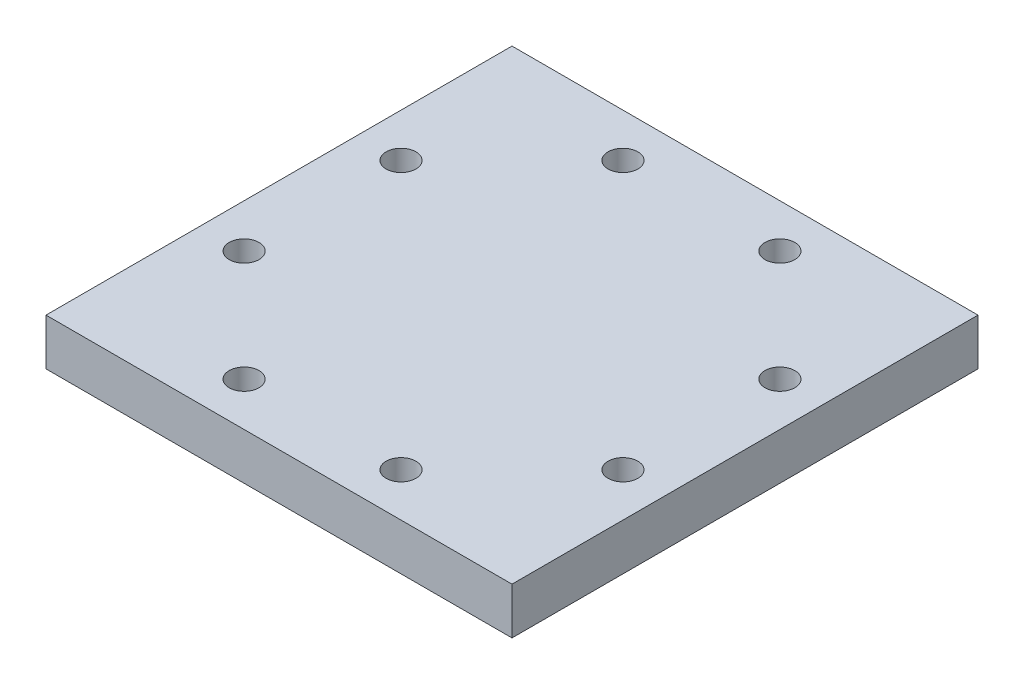
ISO-10303-21;
HEADER;
FILE_DESCRIPTION(('STEP AP214'),'2;1');
FILE_NAME('part.step','',(''),(''),'','','');
FILE_SCHEMA(('AUTOMOTIVE_DESIGN { 1 0 10303 214 1 1 1 1 }'));
ENDSEC;
DATA;
#1=APPLICATION_CONTEXT('core data for automotive mechanical design processes');
#2=APPLICATION_PROTOCOL_DEFINITION('international standard','automotive_design',2000,#1);
#3=PRODUCT_CONTEXT('',#1,'mechanical');
#4=PRODUCT('Part','Part','',(#3));
#5=PRODUCT_RELATED_PRODUCT_CATEGORY('part','',(#4));
#6=PRODUCT_DEFINITION_FORMATION('','',#4);
#7=PRODUCT_DEFINITION_CONTEXT('part definition',#1,'design');
#8=PRODUCT_DEFINITION('design','',#6,#7);
#9=PRODUCT_DEFINITION_SHAPE('','',#8);
#10=(LENGTH_UNIT() NAMED_UNIT(*) SI_UNIT(.MILLI.,.METRE.));
#11=(NAMED_UNIT(*) PLANE_ANGLE_UNIT() SI_UNIT($,.RADIAN.));
#12=(NAMED_UNIT(*) SI_UNIT($,.STERADIAN.) SOLID_ANGLE_UNIT());
#13=UNCERTAINTY_MEASURE_WITH_UNIT(LENGTH_MEASURE(1.E-05),#10,'distance_accuracy_value','');
#14=(GEOMETRIC_REPRESENTATION_CONTEXT(3) GLOBAL_UNCERTAINTY_ASSIGNED_CONTEXT((#13)) GLOBAL_UNIT_ASSIGNED_CONTEXT((#10,
#11,#12)) REPRESENTATION_CONTEXT('',''));
#15=CARTESIAN_POINT('',(0.,0.,0.));
#16=DIRECTION('',(0.,0.,1.));
#17=DIRECTION('',(1.,0.,0.));
#18=AXIS2_PLACEMENT_3D('',#15,#16,#17);
#19=CARTESIAN_POINT('',(25.,5.,-25.));
#20=DIRECTION('',(-1.,0.,0.));
#21=DIRECTION('',(0.,0.,1.));
#22=AXIS2_PLACEMENT_3D('',#19,#20,#21);
#23=PLANE('',#22);
#24=DIRECTION('',(0.,0.,-1.));
#25=VECTOR('',#24,1.);
#26=CARTESIAN_POINT('',(25.,0.,-25.));
#27=LINE('',#26,#25);
#28=CARTESIAN_POINT('',(25.,0.,25.));
#29=VERTEX_POINT('',#28);
#30=CARTESIAN_POINT('',(25.,0.,-25.));
#31=VERTEX_POINT('',#30);
#32=EDGE_CURVE('E98',#29,#31,#27,.T.);
#33=ORIENTED_EDGE('',*,*,#32,.T.);
#34=DIRECTION('',(0.,-1.,0.));
#35=VECTOR('',#34,1.);
#36=CARTESIAN_POINT('',(25.,5.,-25.));
#37=LINE('',#36,#35);
#38=CARTESIAN_POINT('',(25.,5.,-25.));
#39=VERTEX_POINT('',#38);
#40=EDGE_CURVE('E11',#39,#31,#37,.T.);
#41=ORIENTED_EDGE('',*,*,#40,.F.);
#42=DIRECTION('',(0.,0.,-1.));
#43=VECTOR('',#42,1.);
#44=CARTESIAN_POINT('',(25.,5.,-25.));
#45=LINE('',#44,#43);
#46=CARTESIAN_POINT('',(25.,5.,25.));
#47=VERTEX_POINT('',#46);
#48=EDGE_CURVE('E86',#47,#39,#45,.T.);
#49=ORIENTED_EDGE('',*,*,#48,.F.);
#50=DIRECTION('',(0.,-1.,0.));
#51=VECTOR('',#50,1.);
#52=CARTESIAN_POINT('',(25.,5.,25.));
#53=LINE('',#52,#51);
#54=EDGE_CURVE('E94',#47,#29,#53,.T.);
#55=ORIENTED_EDGE('',*,*,#54,.T.);
#56=EDGE_LOOP('',(#33,#41,#49,#55));
#57=FACE_BOUND('',#56,.T.);
#58=ADVANCED_FACE('F35',(#57),#23,.F.);
#59=CARTESIAN_POINT('',(-25.,5.,-25.));
#60=DIRECTION('',(0.,0.,1.));
#61=DIRECTION('',(1.,0.,0.));
#62=AXIS2_PLACEMENT_3D('',#59,#60,#61);
#63=PLANE('',#62);
#64=DIRECTION('',(-1.,0.,0.));
#65=VECTOR('',#64,1.);
#66=CARTESIAN_POINT('',(-25.,0.,-25.));
#67=LINE('',#66,#65);
#68=CARTESIAN_POINT('',(-25.,0.,-25.));
#69=VERTEX_POINT('',#68);
#70=EDGE_CURVE('E90',#31,#69,#67,.T.);
#71=ORIENTED_EDGE('',*,*,#70,.T.);
#72=DIRECTION('',(0.,-1.,0.));
#73=VECTOR('',#72,1.);
#74=CARTESIAN_POINT('',(-25.,5.,-25.));
#75=LINE('',#74,#73);
#76=CARTESIAN_POINT('',(-25.,5.,-25.));
#77=VERTEX_POINT('',#76);
#78=EDGE_CURVE('E43',#77,#69,#75,.T.);
#79=ORIENTED_EDGE('',*,*,#78,.F.);
#80=DIRECTION('',(-1.,0.,0.));
#81=VECTOR('',#80,1.);
#82=CARTESIAN_POINT('',(-25.,5.,-25.));
#83=LINE('',#82,#81);
#84=EDGE_CURVE('E81',#39,#77,#83,.T.);
#85=ORIENTED_EDGE('',*,*,#84,.F.);
#86=ORIENTED_EDGE('',*,*,#40,.T.);
#87=EDGE_LOOP('',(#71,#79,#85,#86));
#88=FACE_BOUND('',#87,.T.);
#89=ADVANCED_FACE('F89',(#88),#63,.F.);
#90=CARTESIAN_POINT('',(-25.,5.,-25.));
#91=DIRECTION('',(1.,0.,0.));
#92=DIRECTION('',(0.,0.,-1.));
#93=AXIS2_PLACEMENT_3D('',#90,#91,#92);
#94=PLANE('',#93);
#95=DIRECTION('',(0.,0.,1.));
#96=VECTOR('',#95,1.);
#97=CARTESIAN_POINT('',(-25.,0.,-25.));
#98=LINE('',#97,#96);
#99=CARTESIAN_POINT('',(-25.,0.,25.));
#100=VERTEX_POINT('',#99);
#101=EDGE_CURVE('E68',#69,#100,#98,.T.);
#102=ORIENTED_EDGE('',*,*,#101,.T.);
#103=DIRECTION('',(0.,-1.,0.));
#104=VECTOR('',#103,1.);
#105=CARTESIAN_POINT('',(-25.,5.,25.));
#106=LINE('',#105,#104);
#107=CARTESIAN_POINT('',(-25.,5.,25.));
#108=VERTEX_POINT('',#107);
#109=EDGE_CURVE('E91',#108,#100,#106,.T.);
#110=ORIENTED_EDGE('',*,*,#109,.F.);
#111=DIRECTION('',(0.,0.,1.));
#112=VECTOR('',#111,1.);
#113=CARTESIAN_POINT('',(-25.,5.,-25.));
#114=LINE('',#113,#112);
#115=EDGE_CURVE('E84',#77,#108,#114,.T.);
#116=ORIENTED_EDGE('',*,*,#115,.F.);
#117=ORIENTED_EDGE('',*,*,#78,.T.);
#118=EDGE_LOOP('',(#102,#110,#116,#117));
#119=FACE_BOUND('',#118,.T.);
#120=ADVANCED_FACE('F92',(#119),#94,.F.);
#121=CARTESIAN_POINT('',(-25.,5.,25.));
#122=DIRECTION('',(0.,0.,-1.));
#123=DIRECTION('',(-1.,0.,0.));
#124=AXIS2_PLACEMENT_3D('',#121,#122,#123);
#125=PLANE('',#124);
#126=DIRECTION('',(1.,0.,0.));
#127=VECTOR('',#126,1.);
#128=CARTESIAN_POINT('',(-25.,0.,25.));
#129=LINE('',#128,#127);
#130=EDGE_CURVE('E74',#100,#29,#129,.T.);
#131=ORIENTED_EDGE('',*,*,#130,.T.);
#132=ORIENTED_EDGE('',*,*,#54,.F.);
#133=DIRECTION('',(1.,0.,0.));
#134=VECTOR('',#133,1.);
#135=CARTESIAN_POINT('',(-25.,5.,25.));
#136=LINE('',#135,#134);
#137=EDGE_CURVE('E51',#108,#47,#136,.T.);
#138=ORIENTED_EDGE('',*,*,#137,.F.);
#139=ORIENTED_EDGE('',*,*,#109,.T.);
#140=EDGE_LOOP('',(#131,#132,#138,#139));
#141=FACE_BOUND('',#140,.T.);
#142=ADVANCED_FACE('F106',(#141),#125,.F.);
#143=CARTESIAN_POINT('',(0.,5.,0.));
#144=DIRECTION('',(0.,1.,0.));
#145=DIRECTION('',(0.,0.,1.));
#146=AXIS2_PLACEMENT_3D('',#143,#144,#145);
#147=PLANE('',#146);
#148=CARTESIAN_POINT('',(20.3253497152484,5.,-8.41903551203202));
#149=DIRECTION('',(0.,1.,0.));
#150=DIRECTION('',(0.,0.,1.));
#151=AXIS2_PLACEMENT_3D('',#148,#149,#150);
#152=CIRCLE('',#151,1.59999999999999);
#153=CARTESIAN_POINT('',(20.3253497152484,5.,-6.81903551203203));
#154=VERTEX_POINT('',#153);
#155=EDGE_CURVE('E156',#154,#154,#152,.T.);
#156=ORIENTED_EDGE('',*,*,#155,.F.);
#157=EDGE_LOOP('',(#156));
#158=FACE_BOUND('',#157,.T.);
#159=CARTESIAN_POINT('',(8.4190355120321,5.,-20.3253497152484));
#160=DIRECTION('',(0.,1.,0.));
#161=DIRECTION('',(0.,0.,1.));
#162=AXIS2_PLACEMENT_3D('',#159,#160,#161);
#163=CIRCLE('',#162,1.59999999999999);
#164=CARTESIAN_POINT('',(8.4190355120321,5.,-18.7253497152484));
#165=VERTEX_POINT('',#164);
#166=EDGE_CURVE('E150',#165,#165,#163,.T.);
#167=ORIENTED_EDGE('',*,*,#166,.F.);
#168=EDGE_LOOP('',(#167));
#169=FACE_BOUND('',#168,.T.);
#170=CARTESIAN_POINT('',(-8.41903551203185,5.,-20.3253497152484));
#171=DIRECTION('',(0.,1.,0.));
#172=DIRECTION('',(0.,0.,1.));
#173=AXIS2_PLACEMENT_3D('',#170,#171,#172);
#174=CIRCLE('',#173,1.59999999999999);
#175=CARTESIAN_POINT('',(-8.41903551203185,5.,-18.7253497152484));
#176=VERTEX_POINT('',#175);
#177=EDGE_CURVE('E144',#176,#176,#174,.T.);
#178=ORIENTED_EDGE('',*,*,#177,.F.);
#179=EDGE_LOOP('',(#178));
#180=FACE_BOUND('',#179,.T.);
#181=CARTESIAN_POINT('',(-20.3253497152482,5.,-8.41903551203202));
#182=DIRECTION('',(0.,1.,0.));
#183=DIRECTION('',(0.,0.,1.));
#184=AXIS2_PLACEMENT_3D('',#181,#182,#183);
#185=CIRCLE('',#184,1.59999999999999);
#186=CARTESIAN_POINT('',(-20.3253497152482,5.,-6.81903551203203));
#187=VERTEX_POINT('',#186);
#188=EDGE_CURVE('E138',#187,#187,#185,.T.);
#189=ORIENTED_EDGE('',*,*,#188,.F.);
#190=EDGE_LOOP('',(#189));
#191=FACE_BOUND('',#190,.T.);
#192=CARTESIAN_POINT('',(-20.3253497152482,5.,8.41903551203194));
#193=DIRECTION('',(0.,1.,0.));
#194=DIRECTION('',(0.,0.,1.));
#195=AXIS2_PLACEMENT_3D('',#192,#193,#194);
#196=CIRCLE('',#195,1.59999999999999);
#197=CARTESIAN_POINT('',(-20.3253497152482,5.,10.0190355120319));
#198=VERTEX_POINT('',#197);
#199=EDGE_CURVE('E132',#198,#198,#196,.T.);
#200=ORIENTED_EDGE('',*,*,#199,.F.);
#201=EDGE_LOOP('',(#200));
#202=FACE_BOUND('',#201,.T.);
#203=CARTESIAN_POINT('',(-8.41903551203185,5.,20.3253497152483));
#204=DIRECTION('',(0.,1.,0.));
#205=DIRECTION('',(0.,0.,1.));
#206=AXIS2_PLACEMENT_3D('',#203,#204,#205);
#207=CIRCLE('',#206,1.59999999999999);
#208=CARTESIAN_POINT('',(-8.41903551203185,5.,21.9253497152483));
#209=VERTEX_POINT('',#208);
#210=EDGE_CURVE('E126',#209,#209,#207,.T.);
#211=ORIENTED_EDGE('',*,*,#210,.F.);
#212=EDGE_LOOP('',(#211));
#213=FACE_BOUND('',#212,.T.);
#214=CARTESIAN_POINT('',(8.4190355120321,5.,20.3253497152483));
#215=DIRECTION('',(0.,1.,0.));
#216=DIRECTION('',(0.,0.,1.));
#217=AXIS2_PLACEMENT_3D('',#214,#215,#216);
#218=CIRCLE('',#217,1.59999999999999);
#219=CARTESIAN_POINT('',(8.4190355120321,5.,21.9253497152483));
#220=VERTEX_POINT('',#219);
#221=EDGE_CURVE('E120',#220,#220,#218,.T.);
#222=ORIENTED_EDGE('',*,*,#221,.F.);
#223=EDGE_LOOP('',(#222));
#224=FACE_BOUND('',#223,.T.);
#225=CARTESIAN_POINT('',(20.3253497152484,5.,8.41903551203194));
#226=DIRECTION('',(0.,1.,0.));
#227=DIRECTION('',(0.,0.,1.));
#228=AXIS2_PLACEMENT_3D('',#225,#226,#227);
#229=CIRCLE('',#228,1.59999999999999);
#230=CARTESIAN_POINT('',(20.3253497152484,5.,10.0190355120319));
#231=VERTEX_POINT('',#230);
#232=EDGE_CURVE('E114',#231,#231,#229,.T.);
#233=ORIENTED_EDGE('',*,*,#232,.F.);
#234=EDGE_LOOP('',(#233));
#235=FACE_BOUND('',#234,.T.);
#236=ORIENTED_EDGE('',*,*,#48,.T.);
#237=ORIENTED_EDGE('',*,*,#84,.T.);
#238=ORIENTED_EDGE('',*,*,#115,.T.);
#239=ORIENTED_EDGE('',*,*,#137,.T.);
#240=EDGE_LOOP('',(#236,#237,#238,#239));
#241=FACE_BOUND('',#240,.T.);
#242=ADVANCED_FACE('F82',(#158,#169,#180,#191,#202,#213,#224,#235,#241),#147,.T.);
#243=CARTESIAN_POINT('',(0.,0.,0.));
#244=DIRECTION('',(0.,1.,0.));
#245=DIRECTION('',(0.,0.,1.));
#246=AXIS2_PLACEMENT_3D('',#243,#244,#245);
#247=PLANE('',#246);
#248=CARTESIAN_POINT('',(20.3253497152484,0.,-8.41903551203202));
#249=DIRECTION('',(0.,1.,0.));
#250=DIRECTION('',(0.,0.,1.));
#251=AXIS2_PLACEMENT_3D('',#248,#249,#250);
#252=CIRCLE('',#251,1.6);
#253=CARTESIAN_POINT('',(20.3253497152484,0.,-6.81903551203202));
#254=VERTEX_POINT('',#253);
#255=EDGE_CURVE('E153',#254,#254,#252,.T.);
#256=ORIENTED_EDGE('',*,*,#255,.T.);
#257=EDGE_LOOP('',(#256));
#258=FACE_BOUND('',#257,.T.);
#259=CARTESIAN_POINT('',(8.4190355120321,0.,-20.3253497152484));
#260=DIRECTION('',(0.,1.,0.));
#261=DIRECTION('',(0.,0.,1.));
#262=AXIS2_PLACEMENT_3D('',#259,#260,#261);
#263=CIRCLE('',#262,1.6);
#264=CARTESIAN_POINT('',(8.4190355120321,0.,-18.7253497152484));
#265=VERTEX_POINT('',#264);
#266=EDGE_CURVE('E147',#265,#265,#263,.T.);
#267=ORIENTED_EDGE('',*,*,#266,.T.);
#268=EDGE_LOOP('',(#267));
#269=FACE_BOUND('',#268,.T.);
#270=CARTESIAN_POINT('',(-8.41903551203185,0.,-20.3253497152484));
#271=DIRECTION('',(0.,1.,0.));
#272=DIRECTION('',(0.,0.,1.));
#273=AXIS2_PLACEMENT_3D('',#270,#271,#272);
#274=CIRCLE('',#273,1.6);
#275=CARTESIAN_POINT('',(-8.41903551203185,0.,-18.7253497152484));
#276=VERTEX_POINT('',#275);
#277=EDGE_CURVE('E141',#276,#276,#274,.T.);
#278=ORIENTED_EDGE('',*,*,#277,.T.);
#279=EDGE_LOOP('',(#278));
#280=FACE_BOUND('',#279,.T.);
#281=CARTESIAN_POINT('',(-20.3253497152482,0.,-8.41903551203202));
#282=DIRECTION('',(0.,1.,0.));
#283=DIRECTION('',(0.,0.,1.));
#284=AXIS2_PLACEMENT_3D('',#281,#282,#283);
#285=CIRCLE('',#284,1.6);
#286=CARTESIAN_POINT('',(-20.3253497152482,0.,-6.81903551203202));
#287=VERTEX_POINT('',#286);
#288=EDGE_CURVE('E135',#287,#287,#285,.T.);
#289=ORIENTED_EDGE('',*,*,#288,.T.);
#290=EDGE_LOOP('',(#289));
#291=FACE_BOUND('',#290,.T.);
#292=CARTESIAN_POINT('',(-20.3253497152482,0.,8.41903551203194));
#293=DIRECTION('',(0.,1.,0.));
#294=DIRECTION('',(0.,0.,1.));
#295=AXIS2_PLACEMENT_3D('',#292,#293,#294);
#296=CIRCLE('',#295,1.6);
#297=CARTESIAN_POINT('',(-20.3253497152482,0.,10.0190355120319));
#298=VERTEX_POINT('',#297);
#299=EDGE_CURVE('E129',#298,#298,#296,.T.);
#300=ORIENTED_EDGE('',*,*,#299,.T.);
#301=EDGE_LOOP('',(#300));
#302=FACE_BOUND('',#301,.T.);
#303=CARTESIAN_POINT('',(-8.41903551203185,0.,20.3253497152483));
#304=DIRECTION('',(0.,1.,0.));
#305=DIRECTION('',(0.,0.,1.));
#306=AXIS2_PLACEMENT_3D('',#303,#304,#305);
#307=CIRCLE('',#306,1.6);
#308=CARTESIAN_POINT('',(-8.41903551203185,0.,21.9253497152483));
#309=VERTEX_POINT('',#308);
#310=EDGE_CURVE('E123',#309,#309,#307,.T.);
#311=ORIENTED_EDGE('',*,*,#310,.T.);
#312=EDGE_LOOP('',(#311));
#313=FACE_BOUND('',#312,.T.);
#314=CARTESIAN_POINT('',(8.4190355120321,0.,20.3253497152483));
#315=DIRECTION('',(0.,1.,0.));
#316=DIRECTION('',(0.,0.,1.));
#317=AXIS2_PLACEMENT_3D('',#314,#315,#316);
#318=CIRCLE('',#317,1.6);
#319=CARTESIAN_POINT('',(8.4190355120321,0.,21.9253497152483));
#320=VERTEX_POINT('',#319);
#321=EDGE_CURVE('E117',#320,#320,#318,.T.);
#322=ORIENTED_EDGE('',*,*,#321,.T.);
#323=EDGE_LOOP('',(#322));
#324=FACE_BOUND('',#323,.T.);
#325=CARTESIAN_POINT('',(20.3253497152484,0.,8.41903551203194));
#326=DIRECTION('',(0.,1.,0.));
#327=DIRECTION('',(0.,0.,1.));
#328=AXIS2_PLACEMENT_3D('',#325,#326,#327);
#329=CIRCLE('',#328,1.6);
#330=CARTESIAN_POINT('',(20.3253497152484,0.,10.0190355120319));
#331=VERTEX_POINT('',#330);
#332=EDGE_CURVE('E101',#331,#331,#329,.T.);
#333=ORIENTED_EDGE('',*,*,#332,.T.);
#334=EDGE_LOOP('',(#333));
#335=FACE_BOUND('',#334,.T.);
#336=ORIENTED_EDGE('',*,*,#32,.F.);
#337=ORIENTED_EDGE('',*,*,#130,.F.);
#338=ORIENTED_EDGE('',*,*,#101,.F.);
#339=ORIENTED_EDGE('',*,*,#70,.F.);
#340=EDGE_LOOP('',(#336,#337,#338,#339));
#341=FACE_BOUND('',#340,.T.);
#342=ADVANCED_FACE('F109',(#258,#269,#280,#291,#302,#313,#324,#335,#341),#247,.F.);
#343=CARTESIAN_POINT('',(20.3253497152484,5.,8.41903551203194));
#344=DIRECTION('',(0.,1.,0.));
#345=DIRECTION('',(0.,0.,1.));
#346=AXIS2_PLACEMENT_3D('',#343,#344,#345);
#347=CYLINDRICAL_SURFACE('',#346,1.59999999999999);
#348=ORIENTED_EDGE('',*,*,#332,.F.);
#349=EDGE_LOOP('',(#348));
#350=FACE_BOUND('',#349,.T.);
#351=ORIENTED_EDGE('',*,*,#232,.T.);
#352=EDGE_LOOP('',(#351));
#353=FACE_BOUND('',#352,.T.);
#354=ADVANCED_FACE('F179',(#350,#353),#347,.F.);
#355=CARTESIAN_POINT('',(8.4190355120321,5.,20.3253497152483));
#356=DIRECTION('',(0.,1.,0.));
#357=DIRECTION('',(0.,0.,1.));
#358=AXIS2_PLACEMENT_3D('',#355,#356,#357);
#359=CYLINDRICAL_SURFACE('',#358,1.59999999999999);
#360=ORIENTED_EDGE('',*,*,#321,.F.);
#361=EDGE_LOOP('',(#360));
#362=FACE_BOUND('',#361,.T.);
#363=ORIENTED_EDGE('',*,*,#221,.T.);
#364=EDGE_LOOP('',(#363));
#365=FACE_BOUND('',#364,.T.);
#366=ADVANCED_FACE('F181',(#362,#365),#359,.F.);
#367=CARTESIAN_POINT('',(-8.41903551203185,5.,20.3253497152483));
#368=DIRECTION('',(0.,1.,0.));
#369=DIRECTION('',(0.,0.,1.));
#370=AXIS2_PLACEMENT_3D('',#367,#368,#369);
#371=CYLINDRICAL_SURFACE('',#370,1.59999999999999);
#372=ORIENTED_EDGE('',*,*,#310,.F.);
#373=EDGE_LOOP('',(#372));
#374=FACE_BOUND('',#373,.T.);
#375=ORIENTED_EDGE('',*,*,#210,.T.);
#376=EDGE_LOOP('',(#375));
#377=FACE_BOUND('',#376,.T.);
#378=ADVANCED_FACE('F188',(#374,#377),#371,.F.);
#379=CARTESIAN_POINT('',(-20.3253497152482,5.,8.41903551203194));
#380=DIRECTION('',(0.,1.,0.));
#381=DIRECTION('',(0.,0.,1.));
#382=AXIS2_PLACEMENT_3D('',#379,#380,#381);
#383=CYLINDRICAL_SURFACE('',#382,1.59999999999999);
#384=ORIENTED_EDGE('',*,*,#299,.F.);
#385=EDGE_LOOP('',(#384));
#386=FACE_BOUND('',#385,.T.);
#387=ORIENTED_EDGE('',*,*,#199,.T.);
#388=EDGE_LOOP('',(#387));
#389=FACE_BOUND('',#388,.T.);
#390=ADVANCED_FACE('F235',(#386,#389),#383,.F.);
#391=CARTESIAN_POINT('',(-20.3253497152482,5.,-8.41903551203202));
#392=DIRECTION('',(0.,1.,0.));
#393=DIRECTION('',(0.,0.,1.));
#394=AXIS2_PLACEMENT_3D('',#391,#392,#393);
#395=CYLINDRICAL_SURFACE('',#394,1.59999999999999);
#396=ORIENTED_EDGE('',*,*,#288,.F.);
#397=EDGE_LOOP('',(#396));
#398=FACE_BOUND('',#397,.T.);
#399=ORIENTED_EDGE('',*,*,#188,.T.);
#400=EDGE_LOOP('',(#399));
#401=FACE_BOUND('',#400,.T.);
#402=ADVANCED_FACE('F245',(#398,#401),#395,.F.);
#403=CARTESIAN_POINT('',(-8.41903551203185,5.,-20.3253497152484));
#404=DIRECTION('',(0.,1.,0.));
#405=DIRECTION('',(0.,0.,1.));
#406=AXIS2_PLACEMENT_3D('',#403,#404,#405);
#407=CYLINDRICAL_SURFACE('',#406,1.59999999999999);
#408=ORIENTED_EDGE('',*,*,#277,.F.);
#409=EDGE_LOOP('',(#408));
#410=FACE_BOUND('',#409,.T.);
#411=ORIENTED_EDGE('',*,*,#177,.T.);
#412=EDGE_LOOP('',(#411));
#413=FACE_BOUND('',#412,.T.);
#414=ADVANCED_FACE('F255',(#410,#413),#407,.F.);
#415=CARTESIAN_POINT('',(8.4190355120321,5.,-20.3253497152484));
#416=DIRECTION('',(0.,1.,0.));
#417=DIRECTION('',(0.,0.,1.));
#418=AXIS2_PLACEMENT_3D('',#415,#416,#417);
#419=CYLINDRICAL_SURFACE('',#418,1.59999999999999);
#420=ORIENTED_EDGE('',*,*,#266,.F.);
#421=EDGE_LOOP('',(#420));
#422=FACE_BOUND('',#421,.T.);
#423=ORIENTED_EDGE('',*,*,#166,.T.);
#424=EDGE_LOOP('',(#423));
#425=FACE_BOUND('',#424,.T.);
#426=ADVANCED_FACE('F265',(#422,#425),#419,.F.);
#427=CARTESIAN_POINT('',(20.3253497152484,5.,-8.41903551203202));
#428=DIRECTION('',(0.,1.,0.));
#429=DIRECTION('',(0.,0.,1.));
#430=AXIS2_PLACEMENT_3D('',#427,#428,#429);
#431=CYLINDRICAL_SURFACE('',#430,1.59999999999999);
#432=ORIENTED_EDGE('',*,*,#255,.F.);
#433=EDGE_LOOP('',(#432));
#434=FACE_BOUND('',#433,.T.);
#435=ORIENTED_EDGE('',*,*,#155,.T.);
#436=EDGE_LOOP('',(#435));
#437=FACE_BOUND('',#436,.T.);
#438=ADVANCED_FACE('F160',(#434,#437),#431,.F.);
#439=CLOSED_SHELL('',(#58,#89,#120,#142,#242,#342,#354,#366,#378,#390,#402,#414,#426,#438));
#440=MANIFOLD_SOLID_BREP('B2',#439);
#441=ADVANCED_BREP_SHAPE_REPRESENTATION('',(#18,#440),#14);
#442=SHAPE_DEFINITION_REPRESENTATION(#9,#441);
ENDSEC;
END-ISO-10303-21;
